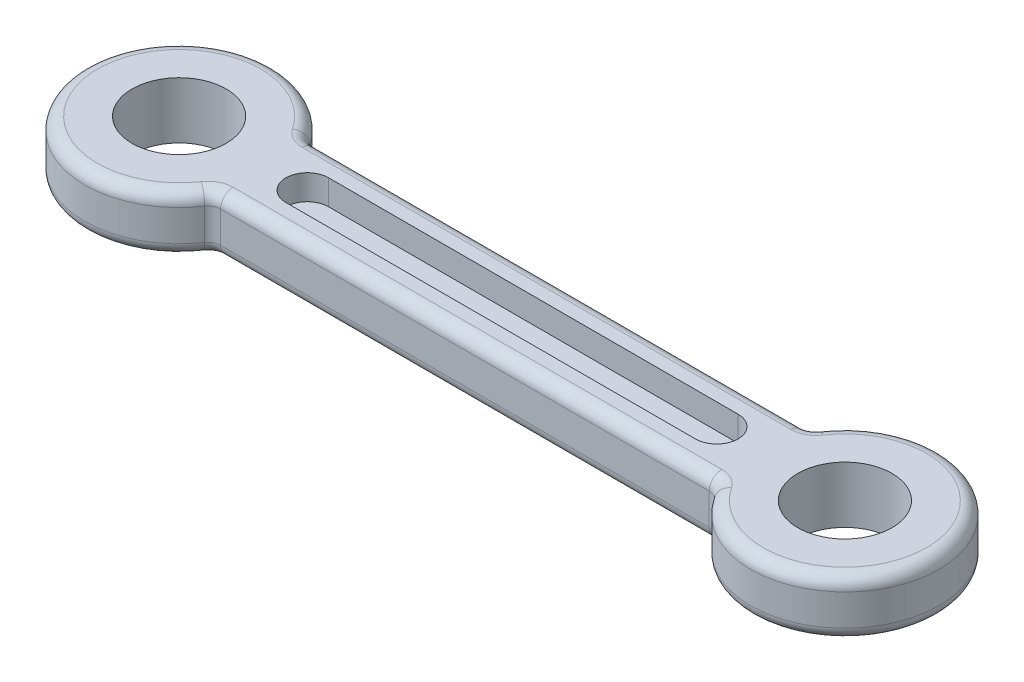
ISO-10303-21;
HEADER;
FILE_DESCRIPTION(('STEP AP214'),'2;1');
FILE_NAME('part.step','',(''),(''),'','','');
FILE_SCHEMA(('AUTOMOTIVE_DESIGN { 1 0 10303 214 1 1 1 1 }'));
ENDSEC;
DATA;
#1=APPLICATION_CONTEXT('core data for automotive mechanical design processes');
#2=APPLICATION_PROTOCOL_DEFINITION('international standard','automotive_design',2000,#1);
#3=PRODUCT_CONTEXT('',#1,'mechanical');
#4=PRODUCT('Part','Part','',(#3));
#5=PRODUCT_RELATED_PRODUCT_CATEGORY('part','',(#4));
#6=PRODUCT_DEFINITION_FORMATION('','',#4);
#7=PRODUCT_DEFINITION_CONTEXT('part definition',#1,'design');
#8=PRODUCT_DEFINITION('design','',#6,#7);
#9=PRODUCT_DEFINITION_SHAPE('','',#8);
#10=(LENGTH_UNIT() NAMED_UNIT(*) SI_UNIT(.MILLI.,.METRE.));
#11=(NAMED_UNIT(*) PLANE_ANGLE_UNIT() SI_UNIT($,.RADIAN.));
#12=(NAMED_UNIT(*) SI_UNIT($,.STERADIAN.) SOLID_ANGLE_UNIT());
#13=UNCERTAINTY_MEASURE_WITH_UNIT(LENGTH_MEASURE(1.E-05),#10,'distance_accuracy_value','');
#14=(GEOMETRIC_REPRESENTATION_CONTEXT(3) GLOBAL_UNCERTAINTY_ASSIGNED_CONTEXT((#13)) GLOBAL_UNIT_ASSIGNED_CONTEXT((#10,
#11,#12)) REPRESENTATION_CONTEXT('',''));
#15=CARTESIAN_POINT('',(0.,0.,0.));
#16=DIRECTION('',(0.,0.,1.));
#17=DIRECTION('',(1.,0.,0.));
#18=AXIS2_PLACEMENT_3D('',#15,#16,#17);
#19=CARTESIAN_POINT('',(134.595567884187,-11.43,0.));
#20=DIRECTION('',(0.,-1.,0.));
#21=DIRECTION('',(0.,0.,-1.));
#22=AXIS2_PLACEMENT_3D('',#19,#20,#21);
#23=PLANE('',#22);
#24=CARTESIAN_POINT('',(-134.595567884187,-11.43,0.));
#25=DIRECTION('',(0.,-1.,0.));
#26=DIRECTION('',(0.,0.,-1.));
#27=AXIS2_PLACEMENT_3D('',#24,#25,#26);
#28=CIRCLE('',#27,33.02);
#29=CARTESIAN_POINT('',(-107.212524391283,-11.43,18.4523529411765));
#30=VERTEX_POINT('',#29);
#31=CARTESIAN_POINT('',(-107.212524391283,-11.43,-18.4523529411765));
#32=VERTEX_POINT('',#31);
#33=EDGE_CURVE('E321',#30,#32,#28,.T.);
#34=ORIENTED_EDGE('',*,*,#33,.T.);
#35=CARTESIAN_POINT('',(-98.786972547313,-11.43,-24.13));
#36=DIRECTION('',(0.,-1.,0.));
#37=DIRECTION('',(0.,0.,-1.));
#38=AXIS2_PLACEMENT_3D('',#35,#36,#37);
#39=CIRCLE('',#38,10.16);
#40=CARTESIAN_POINT('',(-98.786972547313,-11.43,-13.97));
#41=VERTEX_POINT('',#40);
#42=EDGE_CURVE('E335',#32,#41,#39,.F.);
#43=ORIENTED_EDGE('',*,*,#42,.T.);
#44=DIRECTION('',(-1.,0.,0.));
#45=VECTOR('',#44,1.);
#46=CARTESIAN_POINT('',(98.786972547313,-11.43,-13.97));
#47=LINE('',#46,#45);
#48=CARTESIAN_POINT('',(98.786972547313,-11.43,-13.97));
#49=VERTEX_POINT('',#48);
#50=EDGE_CURVE('E333',#41,#49,#47,.F.);
#51=ORIENTED_EDGE('',*,*,#50,.T.);
#52=CARTESIAN_POINT('',(98.786972547313,-11.43,-24.13));
#53=DIRECTION('',(0.,-1.,0.));
#54=DIRECTION('',(0.,0.,-1.));
#55=AXIS2_PLACEMENT_3D('',#52,#53,#54);
#56=CIRCLE('',#55,10.16);
#57=CARTESIAN_POINT('',(107.212524391283,-11.43,-18.4523529411765));
#58=VERTEX_POINT('',#57);
#59=EDGE_CURVE('E331',#49,#58,#56,.F.);
#60=ORIENTED_EDGE('',*,*,#59,.T.);
#61=CARTESIAN_POINT('',(134.595567884187,-11.43,0.));
#62=DIRECTION('',(0.,-1.,0.));
#63=DIRECTION('',(0.,0.,-1.));
#64=AXIS2_PLACEMENT_3D('',#61,#62,#63);
#65=CIRCLE('',#64,33.02);
#66=CARTESIAN_POINT('',(107.212524391283,-11.43,18.4523529411765));
#67=VERTEX_POINT('',#66);
#68=EDGE_CURVE('E329',#58,#67,#65,.T.);
#69=ORIENTED_EDGE('',*,*,#68,.T.);
#70=CARTESIAN_POINT('',(98.786972547313,-11.43,24.13));
#71=DIRECTION('',(0.,-1.,0.));
#72=DIRECTION('',(0.,0.,-1.));
#73=AXIS2_PLACEMENT_3D('',#70,#71,#72);
#74=CIRCLE('',#73,10.16);
#75=CARTESIAN_POINT('',(98.786972547313,-11.43,13.97));
#76=VERTEX_POINT('',#75);
#77=EDGE_CURVE('E327',#67,#76,#74,.F.);
#78=ORIENTED_EDGE('',*,*,#77,.T.);
#79=DIRECTION('',(1.,0.,0.));
#80=VECTOR('',#79,1.);
#81=CARTESIAN_POINT('',(-98.786972547313,-11.43,13.97));
#82=LINE('',#81,#80);
#83=CARTESIAN_POINT('',(-98.786972547313,-11.43,13.97));
#84=VERTEX_POINT('',#83);
#85=EDGE_CURVE('E325',#76,#84,#82,.F.);
#86=ORIENTED_EDGE('',*,*,#85,.T.);
#87=CARTESIAN_POINT('',(-98.786972547313,-11.43,24.13));
#88=DIRECTION('',(0.,-1.,0.));
#89=DIRECTION('',(0.,0.,-1.));
#90=AXIS2_PLACEMENT_3D('',#87,#88,#89);
#91=CIRCLE('',#90,10.16);
#92=EDGE_CURVE('E323',#84,#30,#91,.F.);
#93=ORIENTED_EDGE('',*,*,#92,.T.);
#94=EDGE_LOOP('',(#34,#43,#51,#60,#69,#78,#86,#93));
#95=FACE_BOUND('',#94,.T.);
#96=CARTESIAN_POINT('',(-134.595567884187,-11.43,0.));
#97=DIRECTION('',(0.,1.,0.));
#98=DIRECTION('',(0.,0.,1.));
#99=AXIS2_PLACEMENT_3D('',#96,#97,#98);
#100=CIRCLE('',#99,19.05);
#101=CARTESIAN_POINT('',(-134.595567884187,-11.43,19.05));
#102=VERTEX_POINT('',#101);
#103=EDGE_CURVE('E289',#102,#102,#100,.T.);
#104=ORIENTED_EDGE('',*,*,#103,.T.);
#105=EDGE_LOOP('',(#104));
#106=FACE_BOUND('',#105,.T.);
#107=CARTESIAN_POINT('',(134.595567884187,-11.43,0.));
#108=DIRECTION('',(0.,1.,0.));
#109=DIRECTION('',(0.,0.,-1.));
#110=AXIS2_PLACEMENT_3D('',#107,#108,#109);
#111=CIRCLE('',#110,19.05);
#112=CARTESIAN_POINT('',(134.595567884187,-11.43,-19.05));
#113=VERTEX_POINT('',#112);
#114=EDGE_CURVE('E279',#113,#113,#111,.T.);
#115=ORIENTED_EDGE('',*,*,#114,.T.);
#116=EDGE_LOOP('',(#115));
#117=FACE_BOUND('',#116,.T.);
#118=DIRECTION('',(-1.,0.,0.));
#119=VECTOR('',#118,1.);
#120=CARTESIAN_POINT('',(-82.7792233600561,-11.43,-8.64582999538376));
#121=LINE('',#120,#119);
#122=CARTESIAN_POINT('',(82.7792233600562,-11.43,-8.64582999538376));
#123=VERTEX_POINT('',#122);
#124=CARTESIAN_POINT('',(-82.7792233600561,-11.43,-8.64582999538376));
#125=VERTEX_POINT('',#124);
#126=EDGE_CURVE('E241',#123,#125,#121,.T.);
#127=ORIENTED_EDGE('',*,*,#126,.T.);
#128=CARTESIAN_POINT('',(-82.7792233600561,-11.43,0.));
#129=DIRECTION('',(0.,1.,0.));
#130=DIRECTION('',(0.,0.,1.));
#131=AXIS2_PLACEMENT_3D('',#128,#129,#130);
#132=CIRCLE('',#131,8.64582999538376);
#133=CARTESIAN_POINT('',(-82.7792233600561,-11.43,8.64582999538376));
#134=VERTEX_POINT('',#133);
#135=EDGE_CURVE('E229',#125,#134,#132,.T.);
#136=ORIENTED_EDGE('',*,*,#135,.T.);
#137=DIRECTION('',(1.,0.,0.));
#138=VECTOR('',#137,1.);
#139=CARTESIAN_POINT('',(-82.7792233600561,-11.43,8.64582999538376));
#140=LINE('',#139,#138);
#141=CARTESIAN_POINT('',(82.7792233600562,-11.43,8.64582999538376));
#142=VERTEX_POINT('',#141);
#143=EDGE_CURVE('E233',#134,#142,#140,.T.);
#144=ORIENTED_EDGE('',*,*,#143,.T.);
#145=CARTESIAN_POINT('',(82.7792233600562,-11.43,0.));
#146=DIRECTION('',(0.,1.,0.));
#147=DIRECTION('',(0.,0.,1.));
#148=AXIS2_PLACEMENT_3D('',#145,#146,#147);
#149=CIRCLE('',#148,8.64582999538376);
#150=EDGE_CURVE('E236',#142,#123,#149,.T.);
#151=ORIENTED_EDGE('',*,*,#150,.T.);
#152=EDGE_LOOP('',(#127,#136,#144,#151));
#153=FACE_BOUND('',#152,.T.);
#154=ADVANCED_FACE('F47',(#95,#106,#117,#153),#23,.T.);
#155=CARTESIAN_POINT('',(134.595567884187,11.43,0.));
#156=DIRECTION('',(0.,-1.,0.));
#157=DIRECTION('',(0.,0.,-1.));
#158=AXIS2_PLACEMENT_3D('',#155,#156,#157);
#159=PLANE('',#158);
#160=DIRECTION('',(1.,0.,0.));
#161=VECTOR('',#160,1.);
#162=CARTESIAN_POINT('',(134.595567884187,11.43,13.97));
#163=LINE('',#162,#161);
#164=CARTESIAN_POINT('',(-98.786972547313,11.43,13.97));
#165=VERTEX_POINT('',#164);
#166=CARTESIAN_POINT('',(98.786972547313,11.43,13.97));
#167=VERTEX_POINT('',#166);
#168=EDGE_CURVE('E64',#165,#167,#163,.T.);
#169=ORIENTED_EDGE('',*,*,#168,.T.);
#170=CARTESIAN_POINT('',(98.786972547313,11.43,24.13));
#171=DIRECTION('',(0.,-1.,0.));
#172=DIRECTION('',(0.,0.,-1.));
#173=AXIS2_PLACEMENT_3D('',#170,#171,#172);
#174=CIRCLE('',#173,10.16);
#175=CARTESIAN_POINT('',(107.212524391283,11.43,18.4523529411765));
#176=VERTEX_POINT('',#175);
#177=EDGE_CURVE('E380',#167,#176,#174,.T.);
#178=ORIENTED_EDGE('',*,*,#177,.T.);
#179=CARTESIAN_POINT('',(134.595567884187,11.43,0.));
#180=DIRECTION('',(0.,-1.,0.));
#181=DIRECTION('',(0.,0.,-1.));
#182=AXIS2_PLACEMENT_3D('',#179,#180,#181);
#183=CIRCLE('',#182,33.02);
#184=CARTESIAN_POINT('',(107.212524391283,11.43,-18.4523529411765));
#185=VERTEX_POINT('',#184);
#186=EDGE_CURVE('E368',#176,#185,#183,.F.);
#187=ORIENTED_EDGE('',*,*,#186,.T.);
#188=CARTESIAN_POINT('',(98.786972547313,11.43,-24.13));
#189=DIRECTION('',(0.,-1.,0.));
#190=DIRECTION('',(0.,0.,-1.));
#191=AXIS2_PLACEMENT_3D('',#188,#189,#190);
#192=CIRCLE('',#191,10.16);
#193=CARTESIAN_POINT('',(98.786972547313,11.43,-13.97));
#194=VERTEX_POINT('',#193);
#195=EDGE_CURVE('E370',#185,#194,#192,.T.);
#196=ORIENTED_EDGE('',*,*,#195,.T.);
#197=DIRECTION('',(-1.,0.,0.));
#198=VECTOR('',#197,1.);
#199=CARTESIAN_POINT('',(134.595567884187,11.43,-13.97));
#200=LINE('',#199,#198);
#201=CARTESIAN_POINT('',(-98.786972547313,11.43,-13.97));
#202=VERTEX_POINT('',#201);
#203=EDGE_CURVE('E372',#194,#202,#200,.T.);
#204=ORIENTED_EDGE('',*,*,#203,.T.);
#205=CARTESIAN_POINT('',(-98.786972547313,11.43,-24.13));
#206=DIRECTION('',(0.,-1.,0.));
#207=DIRECTION('',(0.,0.,-1.));
#208=AXIS2_PLACEMENT_3D('',#205,#206,#207);
#209=CIRCLE('',#208,10.16);
#210=CARTESIAN_POINT('',(-107.212524391283,11.43,-18.4523529411765));
#211=VERTEX_POINT('',#210);
#212=EDGE_CURVE('E374',#202,#211,#209,.T.);
#213=ORIENTED_EDGE('',*,*,#212,.T.);
#214=CARTESIAN_POINT('',(-134.595567884187,11.43,0.));
#215=DIRECTION('',(0.,-1.,0.));
#216=DIRECTION('',(0.,0.,-1.));
#217=AXIS2_PLACEMENT_3D('',#214,#215,#216);
#218=CIRCLE('',#217,33.02);
#219=CARTESIAN_POINT('',(-107.212524391283,11.43,18.4523529411765));
#220=VERTEX_POINT('',#219);
#221=EDGE_CURVE('E376',#211,#220,#218,.F.);
#222=ORIENTED_EDGE('',*,*,#221,.T.);
#223=CARTESIAN_POINT('',(-98.786972547313,11.43,24.13));
#224=DIRECTION('',(0.,-1.,0.));
#225=DIRECTION('',(0.,0.,-1.));
#226=AXIS2_PLACEMENT_3D('',#223,#224,#225);
#227=CIRCLE('',#226,10.16);
#228=EDGE_CURVE('E69',#220,#165,#227,.T.);
#229=ORIENTED_EDGE('',*,*,#228,.T.);
#230=EDGE_LOOP('',(#169,#178,#187,#196,#204,#213,#222,#229));
#231=FACE_BOUND('',#230,.T.);
#232=DIRECTION('',(1.,0.,0.));
#233=VECTOR('',#232,1.);
#234=CARTESIAN_POINT('',(-82.7792233600561,11.43,8.64582999538376));
#235=LINE('',#234,#233);
#236=CARTESIAN_POINT('',(-82.7792233600561,11.43,8.64582999538376));
#237=VERTEX_POINT('',#236);
#238=CARTESIAN_POINT('',(82.7792233600562,11.43,8.64582999538376));
#239=VERTEX_POINT('',#238);
#240=EDGE_CURVE('E269',#237,#239,#235,.T.);
#241=ORIENTED_EDGE('',*,*,#240,.F.);
#242=CARTESIAN_POINT('',(-82.7792233600561,11.43,0.));
#243=DIRECTION('',(0.,1.,0.));
#244=DIRECTION('',(0.,0.,1.));
#245=AXIS2_PLACEMENT_3D('',#242,#243,#244);
#246=CIRCLE('',#245,8.64582999538376);
#247=CARTESIAN_POINT('',(-82.7792233600561,11.43,-8.64582999538376));
#248=VERTEX_POINT('',#247);
#249=EDGE_CURVE('E250',#248,#237,#246,.T.);
#250=ORIENTED_EDGE('',*,*,#249,.F.);
#251=DIRECTION('',(-1.,0.,0.));
#252=VECTOR('',#251,1.);
#253=CARTESIAN_POINT('',(-82.7792233600561,11.43,-8.64582999538376));
#254=LINE('',#253,#252);
#255=CARTESIAN_POINT('',(82.7792233600562,11.43,-8.64582999538376));
#256=VERTEX_POINT('',#255);
#257=EDGE_CURVE('E258',#256,#248,#254,.T.);
#258=ORIENTED_EDGE('',*,*,#257,.F.);
#259=CARTESIAN_POINT('',(82.7792233600562,11.43,0.));
#260=DIRECTION('',(0.,1.,0.));
#261=DIRECTION('',(0.,0.,1.));
#262=AXIS2_PLACEMENT_3D('',#259,#260,#261);
#263=CIRCLE('',#262,8.64582999538376);
#264=EDGE_CURVE('E272',#239,#256,#263,.T.);
#265=ORIENTED_EDGE('',*,*,#264,.F.);
#266=EDGE_LOOP('',(#241,#250,#258,#265));
#267=FACE_BOUND('',#266,.T.);
#268=CARTESIAN_POINT('',(-134.595567884187,11.43,0.));
#269=DIRECTION('',(0.,1.,0.));
#270=DIRECTION('',(0.,0.,1.));
#271=AXIS2_PLACEMENT_3D('',#268,#269,#270);
#272=CIRCLE('',#271,19.05);
#273=CARTESIAN_POINT('',(-134.595567884187,11.43,19.05));
#274=VERTEX_POINT('',#273);
#275=EDGE_CURVE('E292',#274,#274,#272,.T.);
#276=ORIENTED_EDGE('',*,*,#275,.F.);
#277=EDGE_LOOP('',(#276));
#278=FACE_BOUND('',#277,.T.);
#279=CARTESIAN_POINT('',(134.595567884187,11.43,0.));
#280=DIRECTION('',(0.,1.,0.));
#281=DIRECTION('',(0.,0.,-1.));
#282=AXIS2_PLACEMENT_3D('',#279,#280,#281);
#283=CIRCLE('',#282,19.05);
#284=CARTESIAN_POINT('',(134.595567884187,11.43,-19.05));
#285=VERTEX_POINT('',#284);
#286=EDGE_CURVE('E286',#285,#285,#283,.T.);
#287=ORIENTED_EDGE('',*,*,#286,.F.);
#288=EDGE_LOOP('',(#287));
#289=FACE_BOUND('',#288,.T.);
#290=ADVANCED_FACE('F529',(#231,#267,#278,#289),#159,.F.);
#291=CARTESIAN_POINT('',(134.595567884187,11.43,0.));
#292=DIRECTION('',(0.,-1.,0.));
#293=DIRECTION('',(0.,0.,-1.));
#294=AXIS2_PLACEMENT_3D('',#291,#292,#293);
#295=CYLINDRICAL_SURFACE('',#294,38.1);
#296=DIRECTION('',(0.,-1.,0.));
#297=VECTOR('',#296,1.);
#298=CARTESIAN_POINT('',(102.999748469298,11.43,21.2911764705882));
#299=LINE('',#298,#297);
#300=CARTESIAN_POINT('',(102.999748469298,6.35,21.2911764705882));
#301=VERTEX_POINT('',#300);
#302=CARTESIAN_POINT('',(102.999748469298,-6.35,21.2911764705882));
#303=VERTEX_POINT('',#302);
#304=EDGE_CURVE('E318',#301,#303,#299,.T.);
#305=ORIENTED_EDGE('',*,*,#304,.T.);
#306=CARTESIAN_POINT('',(134.595567884187,-6.35,0.));
#307=DIRECTION('',(0.,-1.,0.));
#308=DIRECTION('',(0.,0.,-1.));
#309=AXIS2_PLACEMENT_3D('',#306,#307,#308);
#310=CIRCLE('',#309,38.1);
#311=CARTESIAN_POINT('',(102.999748469298,-6.35,-21.2911764705882));
#312=VERTEX_POINT('',#311);
#313=EDGE_CURVE('E353',#303,#312,#310,.F.);
#314=ORIENTED_EDGE('',*,*,#313,.T.);
#315=DIRECTION('',(0.,-1.,0.));
#316=VECTOR('',#315,1.);
#317=CARTESIAN_POINT('',(102.999748469298,11.43,-21.2911764705882));
#318=LINE('',#317,#316);
#319=CARTESIAN_POINT('',(102.999748469298,6.35,-21.2911764705882));
#320=VERTEX_POINT('',#319);
#321=EDGE_CURVE('E315',#312,#320,#318,.F.);
#322=ORIENTED_EDGE('',*,*,#321,.T.);
#323=CARTESIAN_POINT('',(134.595567884187,6.35,0.));
#324=DIRECTION('',(0.,-1.,0.));
#325=DIRECTION('',(0.,0.,-1.));
#326=AXIS2_PLACEMENT_3D('',#323,#324,#325);
#327=CIRCLE('',#326,38.1);
#328=EDGE_CURVE('E351',#320,#301,#327,.T.);
#329=ORIENTED_EDGE('',*,*,#328,.T.);
#330=EDGE_LOOP('',(#305,#314,#322,#329));
#331=FACE_BOUND('',#330,.T.);
#332=ADVANCED_FACE('F497',(#331),#295,.T.);
#333=CARTESIAN_POINT('',(-101.6,11.43,-19.05));
#334=DIRECTION('',(0.,0.,1.));
#335=DIRECTION('',(1.,0.,0.));
#336=AXIS2_PLACEMENT_3D('',#333,#334,#335);
#337=PLANE('',#336);
#338=DIRECTION('',(0.,1.,0.));
#339=VECTOR('',#338,1.);
#340=CARTESIAN_POINT('',(98.786972547313,-11.43,-19.05));
#341=LINE('',#340,#339);
#342=CARTESIAN_POINT('',(98.786972547313,6.35,-19.05));
#343=VERTEX_POINT('',#342);
#344=CARTESIAN_POINT('',(98.786972547313,-6.35,-19.05));
#345=VERTEX_POINT('',#344);
#346=EDGE_CURVE('E303',#343,#345,#341,.F.);
#347=ORIENTED_EDGE('',*,*,#346,.T.);
#348=DIRECTION('',(-1.,0.,0.));
#349=VECTOR('',#348,1.);
#350=CARTESIAN_POINT('',(-98.786972547313,-6.35,-19.05));
#351=LINE('',#350,#349);
#352=CARTESIAN_POINT('',(-98.786972547313,-6.35,-19.05));
#353=VERTEX_POINT('',#352);
#354=EDGE_CURVE('E345',#345,#353,#351,.T.);
#355=ORIENTED_EDGE('',*,*,#354,.T.);
#356=DIRECTION('',(0.,1.,0.));
#357=VECTOR('',#356,1.);
#358=CARTESIAN_POINT('',(-98.786972547313,11.43,-19.05));
#359=LINE('',#358,#357);
#360=CARTESIAN_POINT('',(-98.786972547313,6.35,-19.05));
#361=VERTEX_POINT('',#360);
#362=EDGE_CURVE('E306',#353,#361,#359,.T.);
#363=ORIENTED_EDGE('',*,*,#362,.T.);
#364=DIRECTION('',(-1.,0.,0.));
#365=VECTOR('',#364,1.);
#366=CARTESIAN_POINT('',(-101.6,6.35,-19.05));
#367=LINE('',#366,#365);
#368=EDGE_CURVE('E343',#361,#343,#367,.F.);
#369=ORIENTED_EDGE('',*,*,#368,.T.);
#370=EDGE_LOOP('',(#347,#355,#363,#369));
#371=FACE_BOUND('',#370,.T.);
#372=ADVANCED_FACE('F441',(#371),#337,.F.);
#373=CARTESIAN_POINT('',(-134.595567884187,11.43,0.));
#374=DIRECTION('',(0.,-1.,0.));
#375=DIRECTION('',(0.,0.,-1.));
#376=AXIS2_PLACEMENT_3D('',#373,#374,#375);
#377=CYLINDRICAL_SURFACE('',#376,38.1);
#378=DIRECTION('',(0.,-1.,0.));
#379=VECTOR('',#378,1.);
#380=CARTESIAN_POINT('',(-102.999748469298,11.43,21.2911764705882));
#381=LINE('',#380,#379);
#382=CARTESIAN_POINT('',(-102.999748469298,-6.35,21.2911764705882));
#383=VERTEX_POINT('',#382);
#384=CARTESIAN_POINT('',(-102.999748469298,6.35,21.2911764705882));
#385=VERTEX_POINT('',#384);
#386=EDGE_CURVE('E295',#383,#385,#381,.F.);
#387=ORIENTED_EDGE('',*,*,#386,.T.);
#388=CARTESIAN_POINT('',(-134.595567884187,6.35,0.));
#389=DIRECTION('',(0.,-1.,0.));
#390=DIRECTION('',(0.,0.,-1.));
#391=AXIS2_PLACEMENT_3D('',#388,#389,#390);
#392=CIRCLE('',#391,38.1);
#393=CARTESIAN_POINT('',(-102.999748469298,6.35,-21.2911764705882));
#394=VERTEX_POINT('',#393);
#395=EDGE_CURVE('E12',#385,#394,#392,.T.);
#396=ORIENTED_EDGE('',*,*,#395,.T.);
#397=DIRECTION('',(0.,-1.,0.));
#398=VECTOR('',#397,1.);
#399=CARTESIAN_POINT('',(-102.999748469298,11.43,-21.2911764705882));
#400=LINE('',#399,#398);
#401=CARTESIAN_POINT('',(-102.999748469298,-6.35,-21.2911764705882));
#402=VERTEX_POINT('',#401);
#403=EDGE_CURVE('E300',#394,#402,#400,.T.);
#404=ORIENTED_EDGE('',*,*,#403,.T.);
#405=CARTESIAN_POINT('',(-134.595567884187,-6.35,0.));
#406=DIRECTION('',(0.,-1.,0.));
#407=DIRECTION('',(0.,0.,-1.));
#408=AXIS2_PLACEMENT_3D('',#405,#406,#407);
#409=CIRCLE('',#408,38.1);
#410=EDGE_CURVE('E56',#402,#383,#409,.F.);
#411=ORIENTED_EDGE('',*,*,#410,.T.);
#412=EDGE_LOOP('',(#387,#396,#404,#411));
#413=FACE_BOUND('',#412,.T.);
#414=ADVANCED_FACE('F455',(#413),#377,.T.);
#415=CARTESIAN_POINT('',(-101.6,11.43,19.05));
#416=DIRECTION('',(0.,0.,-1.));
#417=DIRECTION('',(-1.,0.,0.));
#418=AXIS2_PLACEMENT_3D('',#415,#416,#417);
#419=PLANE('',#418);
#420=DIRECTION('',(0.,1.,0.));
#421=VECTOR('',#420,1.);
#422=CARTESIAN_POINT('',(-98.786972547313,-11.43,19.05));
#423=LINE('',#422,#421);
#424=CARTESIAN_POINT('',(-98.786972547313,6.35,19.05));
#425=VERTEX_POINT('',#424);
#426=CARTESIAN_POINT('',(-98.786972547313,-6.35,19.05));
#427=VERTEX_POINT('',#426);
#428=EDGE_CURVE('E312',#425,#427,#423,.F.);
#429=ORIENTED_EDGE('',*,*,#428,.T.);
#430=DIRECTION('',(1.,0.,0.));
#431=VECTOR('',#430,1.);
#432=CARTESIAN_POINT('',(98.786972547313,-6.35,19.05));
#433=LINE('',#432,#431);
#434=CARTESIAN_POINT('',(98.786972547313,-6.35,19.05));
#435=VERTEX_POINT('',#434);
#436=EDGE_CURVE('E362',#427,#435,#433,.T.);
#437=ORIENTED_EDGE('',*,*,#436,.T.);
#438=DIRECTION('',(0.,1.,0.));
#439=VECTOR('',#438,1.);
#440=CARTESIAN_POINT('',(98.786972547313,11.43,19.05));
#441=LINE('',#440,#439);
#442=CARTESIAN_POINT('',(98.786972547313,6.35,19.05));
#443=VERTEX_POINT('',#442);
#444=EDGE_CURVE('E309',#435,#443,#441,.T.);
#445=ORIENTED_EDGE('',*,*,#444,.T.);
#446=DIRECTION('',(1.,0.,0.));
#447=VECTOR('',#446,1.);
#448=CARTESIAN_POINT('',(-101.6,6.35,19.05));
#449=LINE('',#448,#447);
#450=EDGE_CURVE('E360',#443,#425,#449,.F.);
#451=ORIENTED_EDGE('',*,*,#450,.T.);
#452=EDGE_LOOP('',(#429,#437,#445,#451));
#453=FACE_BOUND('',#452,.T.);
#454=ADVANCED_FACE('F480',(#453),#419,.F.);
#455=CARTESIAN_POINT('',(-134.595567884187,11.43,0.));
#456=DIRECTION('',(0.,-1.,0.));
#457=DIRECTION('',(0.,0.,-1.));
#458=AXIS2_PLACEMENT_3D('',#455,#456,#457);
#459=CYLINDRICAL_SURFACE('',#458,19.05);
#460=ORIENTED_EDGE('',*,*,#275,.T.);
#461=EDGE_LOOP('',(#460));
#462=FACE_BOUND('',#461,.T.);
#463=ORIENTED_EDGE('',*,*,#103,.F.);
#464=EDGE_LOOP('',(#463));
#465=FACE_BOUND('',#464,.T.);
#466=ADVANCED_FACE('F539',(#462,#465),#459,.F.);
#467=CARTESIAN_POINT('',(134.595567884187,11.43,0.));
#468=DIRECTION('',(0.,-1.,0.));
#469=DIRECTION('',(0.,0.,-1.));
#470=AXIS2_PLACEMENT_3D('',#467,#468,#469);
#471=CYLINDRICAL_SURFACE('',#470,19.05);
#472=ORIENTED_EDGE('',*,*,#286,.T.);
#473=EDGE_LOOP('',(#472));
#474=FACE_BOUND('',#473,.T.);
#475=ORIENTED_EDGE('',*,*,#114,.F.);
#476=EDGE_LOOP('',(#475));
#477=FACE_BOUND('',#476,.T.);
#478=ADVANCED_FACE('F786',(#474,#477),#471,.F.);
#479=CARTESIAN_POINT('',(-82.7792233600561,1.27,0.));
#480=DIRECTION('',(0.,1.,0.));
#481=DIRECTION('',(0.,0.,1.));
#482=AXIS2_PLACEMENT_3D('',#479,#480,#481);
#483=CYLINDRICAL_SURFACE('',#482,8.64582999538376);
#484=ORIENTED_EDGE('',*,*,#249,.T.);
#485=DIRECTION('',(0.,1.,0.));
#486=VECTOR('',#485,1.);
#487=CARTESIAN_POINT('',(-82.7792233600561,1.27,8.64582999538376));
#488=LINE('',#487,#486);
#489=CARTESIAN_POINT('',(-82.7792233600561,1.27,8.64582999538376));
#490=VERTEX_POINT('',#489);
#491=EDGE_CURVE('E267',#490,#237,#488,.T.);
#492=ORIENTED_EDGE('',*,*,#491,.F.);
#493=CARTESIAN_POINT('',(-82.7792233600561,1.27,0.));
#494=DIRECTION('',(0.,1.,0.));
#495=DIRECTION('',(0.,0.,1.));
#496=AXIS2_PLACEMENT_3D('',#493,#494,#495);
#497=CIRCLE('',#496,8.64582999538376);
#498=CARTESIAN_POINT('',(-82.7792233600561,1.27,-8.64582999538376));
#499=VERTEX_POINT('',#498);
#500=EDGE_CURVE('E254',#499,#490,#497,.T.);
#501=ORIENTED_EDGE('',*,*,#500,.F.);
#502=DIRECTION('',(0.,1.,0.));
#503=VECTOR('',#502,1.);
#504=CARTESIAN_POINT('',(-82.7792233600561,1.27,-8.64582999538376));
#505=LINE('',#504,#503);
#506=EDGE_CURVE('E277',#499,#248,#505,.T.);
#507=ORIENTED_EDGE('',*,*,#506,.T.);
#508=EDGE_LOOP('',(#484,#492,#501,#507));
#509=FACE_BOUND('',#508,.T.);
#510=ADVANCED_FACE('F777',(#509),#483,.F.);
#511=CARTESIAN_POINT('',(-82.7792233600561,1.27,-8.64582999538376));
#512=DIRECTION('',(0.,0.,-1.));
#513=DIRECTION('',(-1.,0.,0.));
#514=AXIS2_PLACEMENT_3D('',#511,#512,#513);
#515=PLANE('',#514);
#516=ORIENTED_EDGE('',*,*,#257,.T.);
#517=ORIENTED_EDGE('',*,*,#506,.F.);
#518=DIRECTION('',(-1.,0.,0.));
#519=VECTOR('',#518,1.);
#520=CARTESIAN_POINT('',(-82.7792233600561,1.27,-8.64582999538376));
#521=LINE('',#520,#519);
#522=CARTESIAN_POINT('',(82.7792233600562,1.27,-8.64582999538376));
#523=VERTEX_POINT('',#522);
#524=EDGE_CURVE('E264',#523,#499,#521,.T.);
#525=ORIENTED_EDGE('',*,*,#524,.F.);
#526=DIRECTION('',(0.,1.,0.));
#527=VECTOR('',#526,1.);
#528=CARTESIAN_POINT('',(82.7792233600562,1.27,-8.64582999538376));
#529=LINE('',#528,#527);
#530=EDGE_CURVE('E280',#523,#256,#529,.T.);
#531=ORIENTED_EDGE('',*,*,#530,.T.);
#532=EDGE_LOOP('',(#516,#517,#525,#531));
#533=FACE_BOUND('',#532,.T.);
#534=ADVANCED_FACE('F768',(#533),#515,.F.);
#535=CARTESIAN_POINT('',(82.7792233600562,1.27,0.));
#536=DIRECTION('',(0.,1.,0.));
#537=DIRECTION('',(0.,0.,1.));
#538=AXIS2_PLACEMENT_3D('',#535,#536,#537);
#539=CYLINDRICAL_SURFACE('',#538,8.64582999538376);
#540=ORIENTED_EDGE('',*,*,#264,.T.);
#541=ORIENTED_EDGE('',*,*,#530,.F.);
#542=CARTESIAN_POINT('',(82.7792233600562,1.27,0.));
#543=DIRECTION('',(0.,1.,0.));
#544=DIRECTION('',(0.,0.,1.));
#545=AXIS2_PLACEMENT_3D('',#542,#543,#544);
#546=CIRCLE('',#545,8.64582999538376);
#547=CARTESIAN_POINT('',(82.7792233600562,1.27,8.64582999538376));
#548=VERTEX_POINT('',#547);
#549=EDGE_CURVE('E261',#548,#523,#546,.T.);
#550=ORIENTED_EDGE('',*,*,#549,.F.);
#551=DIRECTION('',(0.,1.,0.));
#552=VECTOR('',#551,1.);
#553=CARTESIAN_POINT('',(82.7792233600562,1.27,8.64582999538376));
#554=LINE('',#553,#552);
#555=EDGE_CURVE('E282',#548,#239,#554,.T.);
#556=ORIENTED_EDGE('',*,*,#555,.T.);
#557=EDGE_LOOP('',(#540,#541,#550,#556));
#558=FACE_BOUND('',#557,.T.);
#559=ADVANCED_FACE('F759',(#558),#539,.F.);
#560=CARTESIAN_POINT('',(-82.7792233600561,1.27,8.64582999538376));
#561=DIRECTION('',(0.,0.,1.));
#562=DIRECTION('',(1.,0.,0.));
#563=AXIS2_PLACEMENT_3D('',#560,#561,#562);
#564=PLANE('',#563);
#565=ORIENTED_EDGE('',*,*,#240,.T.);
#566=ORIENTED_EDGE('',*,*,#555,.F.);
#567=DIRECTION('',(1.,0.,0.));
#568=VECTOR('',#567,1.);
#569=CARTESIAN_POINT('',(-82.7792233600561,1.27,8.64582999538376));
#570=LINE('',#569,#568);
#571=EDGE_CURVE('E257',#490,#548,#570,.T.);
#572=ORIENTED_EDGE('',*,*,#571,.F.);
#573=ORIENTED_EDGE('',*,*,#491,.T.);
#574=EDGE_LOOP('',(#565,#566,#572,#573));
#575=FACE_BOUND('',#574,.T.);
#576=ADVANCED_FACE('F750',(#575),#564,.F.);
#577=CARTESIAN_POINT('',(-82.7792233600561,1.27,0.));
#578=DIRECTION('',(0.,1.,0.));
#579=DIRECTION('',(0.,0.,1.));
#580=AXIS2_PLACEMENT_3D('',#577,#578,#579);
#581=PLANE('',#580);
#582=ORIENTED_EDGE('',*,*,#500,.T.);
#583=ORIENTED_EDGE('',*,*,#571,.T.);
#584=ORIENTED_EDGE('',*,*,#549,.T.);
#585=ORIENTED_EDGE('',*,*,#524,.T.);
#586=EDGE_LOOP('',(#582,#583,#584,#585));
#587=FACE_BOUND('',#586,.T.);
#588=ADVANCED_FACE('F737',(#587),#581,.T.);
#589=CARTESIAN_POINT('',(-82.7792233600561,-1.27,0.));
#590=DIRECTION('',(0.,-1.,0.));
#591=DIRECTION('',(0.,0.,-1.));
#592=AXIS2_PLACEMENT_3D('',#589,#590,#591);
#593=CYLINDRICAL_SURFACE('',#592,8.64582999538376);
#594=ORIENTED_EDGE('',*,*,#135,.F.);
#595=DIRECTION('',(0.,-1.,0.));
#596=VECTOR('',#595,1.);
#597=CARTESIAN_POINT('',(-82.7792233600561,-1.27,-8.64582999538376));
#598=LINE('',#597,#596);
#599=CARTESIAN_POINT('',(-82.7792233600561,-1.27,-8.64582999538376));
#600=VERTEX_POINT('',#599);
#601=EDGE_CURVE('E214',#600,#125,#598,.T.);
#602=ORIENTED_EDGE('',*,*,#601,.F.);
#603=CARTESIAN_POINT('',(-82.7792233600561,-1.27,0.));
#604=DIRECTION('',(0.,1.,0.));
#605=DIRECTION('',(0.,0.,1.));
#606=AXIS2_PLACEMENT_3D('',#603,#604,#605);
#607=CIRCLE('',#606,8.64582999538376);
#608=CARTESIAN_POINT('',(-82.7792233600561,-1.27,8.64582999538376));
#609=VERTEX_POINT('',#608);
#610=EDGE_CURVE('E221',#600,#609,#607,.T.);
#611=ORIENTED_EDGE('',*,*,#610,.T.);
#612=DIRECTION('',(0.,-1.,0.));
#613=VECTOR('',#612,1.);
#614=CARTESIAN_POINT('',(-82.7792233600561,-1.27,8.64582999538376));
#615=LINE('',#614,#613);
#616=EDGE_CURVE('E248',#609,#134,#615,.T.);
#617=ORIENTED_EDGE('',*,*,#616,.T.);
#618=EDGE_LOOP('',(#594,#602,#611,#617));
#619=FACE_BOUND('',#618,.T.);
#620=ADVANCED_FACE('F225',(#619),#593,.F.);
#621=CARTESIAN_POINT('',(-82.7792233600561,-1.27,8.64582999538376));
#622=DIRECTION('',(0.,0.,-1.));
#623=DIRECTION('',(-1.,0.,0.));
#624=AXIS2_PLACEMENT_3D('',#621,#622,#623);
#625=PLANE('',#624);
#626=ORIENTED_EDGE('',*,*,#143,.F.);
#627=ORIENTED_EDGE('',*,*,#616,.F.);
#628=DIRECTION('',(1.,0.,0.));
#629=VECTOR('',#628,1.);
#630=CARTESIAN_POINT('',(-82.7792233600561,-1.27,8.64582999538376));
#631=LINE('',#630,#629);
#632=CARTESIAN_POINT('',(82.7792233600562,-1.27,8.64582999538376));
#633=VERTEX_POINT('',#632);
#634=EDGE_CURVE('E230',#609,#633,#631,.T.);
#635=ORIENTED_EDGE('',*,*,#634,.T.);
#636=DIRECTION('',(0.,-1.,0.));
#637=VECTOR('',#636,1.);
#638=CARTESIAN_POINT('',(82.7792233600562,-1.27,8.64582999538376));
#639=LINE('',#638,#637);
#640=EDGE_CURVE('E251',#633,#142,#639,.T.);
#641=ORIENTED_EDGE('',*,*,#640,.T.);
#642=EDGE_LOOP('',(#626,#627,#635,#641));
#643=FACE_BOUND('',#642,.T.);
#644=ADVANCED_FACE('F720',(#643),#625,.T.);
#645=CARTESIAN_POINT('',(82.7792233600562,-1.27,0.));
#646=DIRECTION('',(0.,-1.,0.));
#647=DIRECTION('',(0.,0.,-1.));
#648=AXIS2_PLACEMENT_3D('',#645,#646,#647);
#649=CYLINDRICAL_SURFACE('',#648,8.64582999538376);
#650=ORIENTED_EDGE('',*,*,#150,.F.);
#651=ORIENTED_EDGE('',*,*,#640,.F.);
#652=CARTESIAN_POINT('',(82.7792233600562,-1.27,0.));
#653=DIRECTION('',(0.,1.,0.));
#654=DIRECTION('',(0.,0.,1.));
#655=AXIS2_PLACEMENT_3D('',#652,#653,#654);
#656=CIRCLE('',#655,8.64582999538376);
#657=CARTESIAN_POINT('',(82.7792233600562,-1.27,-8.64582999538376));
#658=VERTEX_POINT('',#657);
#659=EDGE_CURVE('E220',#633,#658,#656,.T.);
#660=ORIENTED_EDGE('',*,*,#659,.T.);
#661=DIRECTION('',(0.,-1.,0.));
#662=VECTOR('',#661,1.);
#663=CARTESIAN_POINT('',(82.7792233600562,-1.27,-8.64582999538376));
#664=LINE('',#663,#662);
#665=EDGE_CURVE('E216',#658,#123,#664,.T.);
#666=ORIENTED_EDGE('',*,*,#665,.T.);
#667=EDGE_LOOP('',(#650,#651,#660,#666));
#668=FACE_BOUND('',#667,.T.);
#669=ADVANCED_FACE('F712',(#668),#649,.F.);
#670=CARTESIAN_POINT('',(-82.7792233600561,-1.27,-8.64582999538376));
#671=DIRECTION('',(0.,0.,1.));
#672=DIRECTION('',(1.,0.,0.));
#673=AXIS2_PLACEMENT_3D('',#670,#671,#672);
#674=PLANE('',#673);
#675=ORIENTED_EDGE('',*,*,#126,.F.);
#676=ORIENTED_EDGE('',*,*,#665,.F.);
#677=DIRECTION('',(-1.,0.,0.));
#678=VECTOR('',#677,1.);
#679=CARTESIAN_POINT('',(-82.7792233600561,-1.27,-8.64582999538376));
#680=LINE('',#679,#678);
#681=EDGE_CURVE('E210',#658,#600,#680,.T.);
#682=ORIENTED_EDGE('',*,*,#681,.T.);
#683=ORIENTED_EDGE('',*,*,#601,.T.);
#684=EDGE_LOOP('',(#675,#676,#682,#683));
#685=FACE_BOUND('',#684,.T.);
#686=ADVANCED_FACE('F213',(#685),#674,.T.);
#687=CARTESIAN_POINT('',(-82.7792233600561,-1.27,0.));
#688=DIRECTION('',(0.,-1.,0.));
#689=DIRECTION('',(0.,0.,1.));
#690=AXIS2_PLACEMENT_3D('',#687,#688,#689);
#691=PLANE('',#690);
#692=ORIENTED_EDGE('',*,*,#610,.F.);
#693=ORIENTED_EDGE('',*,*,#681,.F.);
#694=ORIENTED_EDGE('',*,*,#659,.F.);
#695=ORIENTED_EDGE('',*,*,#634,.F.);
#696=EDGE_LOOP('',(#692,#693,#694,#695));
#697=FACE_BOUND('',#696,.T.);
#698=ADVANCED_FACE('F232',(#697),#691,.T.);
#699=CARTESIAN_POINT('',(-98.786972547313,11.43,-24.13));
#700=DIRECTION('',(0.,-1.,0.));
#701=DIRECTION('',(0.,0.,-1.));
#702=AXIS2_PLACEMENT_3D('',#699,#700,#701);
#703=CYLINDRICAL_SURFACE('',#702,5.08);
#704=ORIENTED_EDGE('',*,*,#362,.F.);
#705=CARTESIAN_POINT('',(-98.786972547313,-6.35,-24.13));
#706=DIRECTION('',(0.,-1.,0.));
#707=DIRECTION('',(0.,0.,-1.));
#708=AXIS2_PLACEMENT_3D('',#705,#706,#707);
#709=CIRCLE('',#708,5.08);
#710=EDGE_CURVE('E340',#353,#402,#709,.T.);
#711=ORIENTED_EDGE('',*,*,#710,.T.);
#712=ORIENTED_EDGE('',*,*,#403,.F.);
#713=CARTESIAN_POINT('',(-98.786972547313,6.35,-24.13));
#714=DIRECTION('',(0.,-1.,0.));
#715=DIRECTION('',(0.,0.,-1.));
#716=AXIS2_PLACEMENT_3D('',#713,#714,#715);
#717=CIRCLE('',#716,5.08);
#718=EDGE_CURVE('E338',#394,#361,#717,.F.);
#719=ORIENTED_EDGE('',*,*,#718,.T.);
#720=EDGE_LOOP('',(#704,#711,#712,#719));
#721=FACE_BOUND('',#720,.T.);
#722=ADVANCED_FACE('F438',(#721),#703,.F.);
#723=CARTESIAN_POINT('',(-98.786972547313,11.43,24.13));
#724=DIRECTION('',(0.,-1.,0.));
#725=DIRECTION('',(0.,0.,-1.));
#726=AXIS2_PLACEMENT_3D('',#723,#724,#725);
#727=CYLINDRICAL_SURFACE('',#726,5.08);
#728=ORIENTED_EDGE('',*,*,#386,.F.);
#729=CARTESIAN_POINT('',(-98.786972547313,-6.35,24.13));
#730=DIRECTION('',(0.,-1.,0.));
#731=DIRECTION('',(0.,0.,-1.));
#732=AXIS2_PLACEMENT_3D('',#729,#730,#731);
#733=CIRCLE('',#732,5.08);
#734=EDGE_CURVE('E366',#383,#427,#733,.T.);
#735=ORIENTED_EDGE('',*,*,#734,.T.);
#736=ORIENTED_EDGE('',*,*,#428,.F.);
#737=CARTESIAN_POINT('',(-98.786972547313,6.35,24.13));
#738=DIRECTION('',(0.,-1.,0.));
#739=DIRECTION('',(0.,0.,-1.));
#740=AXIS2_PLACEMENT_3D('',#737,#738,#739);
#741=CIRCLE('',#740,5.08);
#742=EDGE_CURVE('E364',#425,#385,#741,.F.);
#743=ORIENTED_EDGE('',*,*,#742,.T.);
#744=EDGE_LOOP('',(#728,#735,#736,#743));
#745=FACE_BOUND('',#744,.T.);
#746=ADVANCED_FACE('F459',(#745),#727,.F.);
#747=CARTESIAN_POINT('',(98.786972547313,11.43,24.13));
#748=DIRECTION('',(0.,-1.,0.));
#749=DIRECTION('',(0.,0.,-1.));
#750=AXIS2_PLACEMENT_3D('',#747,#748,#749);
#751=CYLINDRICAL_SURFACE('',#750,5.08);
#752=ORIENTED_EDGE('',*,*,#444,.F.);
#753=CARTESIAN_POINT('',(98.786972547313,-6.35,24.13));
#754=DIRECTION('',(0.,-1.,0.));
#755=DIRECTION('',(0.,0.,-1.));
#756=AXIS2_PLACEMENT_3D('',#753,#754,#755);
#757=CIRCLE('',#756,5.08);
#758=EDGE_CURVE('E358',#435,#303,#757,.T.);
#759=ORIENTED_EDGE('',*,*,#758,.T.);
#760=ORIENTED_EDGE('',*,*,#304,.F.);
#761=CARTESIAN_POINT('',(98.786972547313,6.35,24.13));
#762=DIRECTION('',(0.,-1.,0.));
#763=DIRECTION('',(0.,0.,-1.));
#764=AXIS2_PLACEMENT_3D('',#761,#762,#763);
#765=CIRCLE('',#764,5.08);
#766=EDGE_CURVE('E355',#301,#443,#765,.F.);
#767=ORIENTED_EDGE('',*,*,#766,.T.);
#768=EDGE_LOOP('',(#752,#759,#760,#767));
#769=FACE_BOUND('',#768,.T.);
#770=ADVANCED_FACE('F483',(#769),#751,.F.);
#771=CARTESIAN_POINT('',(98.786972547313,11.43,-24.13));
#772=DIRECTION('',(0.,-1.,0.));
#773=DIRECTION('',(0.,0.,-1.));
#774=AXIS2_PLACEMENT_3D('',#771,#772,#773);
#775=CYLINDRICAL_SURFACE('',#774,5.08);
#776=ORIENTED_EDGE('',*,*,#321,.F.);
#777=CARTESIAN_POINT('',(98.786972547313,-6.35,-24.13));
#778=DIRECTION('',(0.,-1.,0.));
#779=DIRECTION('',(0.,0.,-1.));
#780=AXIS2_PLACEMENT_3D('',#777,#778,#779);
#781=CIRCLE('',#780,5.08);
#782=EDGE_CURVE('E349',#312,#345,#781,.T.);
#783=ORIENTED_EDGE('',*,*,#782,.T.);
#784=ORIENTED_EDGE('',*,*,#346,.F.);
#785=CARTESIAN_POINT('',(98.786972547313,6.35,-24.13));
#786=DIRECTION('',(0.,-1.,0.));
#787=DIRECTION('',(0.,0.,-1.));
#788=AXIS2_PLACEMENT_3D('',#785,#786,#787);
#789=CIRCLE('',#788,5.08);
#790=EDGE_CURVE('E347',#343,#320,#789,.F.);
#791=ORIENTED_EDGE('',*,*,#790,.T.);
#792=EDGE_LOOP('',(#776,#783,#784,#791));
#793=FACE_BOUND('',#792,.T.);
#794=ADVANCED_FACE('F500',(#793),#775,.F.);
#795=CARTESIAN_POINT('',(98.786972547313,-6.35,24.13));
#796=DIRECTION('',(0.,-1.,0.));
#797=DIRECTION('',(0.,0.,-1.));
#798=AXIS2_PLACEMENT_3D('',#795,#796,#797);
#799=TOROIDAL_SURFACE('',#798,10.16,5.08);
#800=CARTESIAN_POINT('',(107.212524391283,-6.35,18.4523529411765));
#801=DIRECTION('',(0.558823529411765,0.,0.829286598815981));
#802=DIRECTION('',(0.829286598815981,0.,-0.558823529411765));
#803=AXIS2_PLACEMENT_3D('',#800,#801,#802);
#804=CIRCLE('',#803,5.08);
#805=EDGE_CURVE('E399',#303,#67,#804,.T.);
#806=ORIENTED_EDGE('',*,*,#805,.F.);
#807=ORIENTED_EDGE('',*,*,#758,.F.);
#808=CARTESIAN_POINT('',(98.786972547313,-6.35,13.97));
#809=DIRECTION('',(-1.,0.,0.));
#810=DIRECTION('',(0.,0.,1.));
#811=AXIS2_PLACEMENT_3D('',#808,#809,#810);
#812=CIRCLE('',#811,5.08);
#813=EDGE_CURVE('E242',#76,#435,#812,.T.);
#814=ORIENTED_EDGE('',*,*,#813,.F.);
#815=ORIENTED_EDGE('',*,*,#77,.F.);
#816=EDGE_LOOP('',(#806,#807,#814,#815));
#817=FACE_BOUND('',#816,.T.);
#818=ADVANCED_FACE('F488',(#817),#799,.T.);
#819=CARTESIAN_POINT('',(-101.6,-6.35,13.97));
#820=DIRECTION('',(-1.,0.,0.));
#821=DIRECTION('',(0.,0.,1.));
#822=AXIS2_PLACEMENT_3D('',#819,#820,#821);
#823=CYLINDRICAL_SURFACE('',#822,5.08);
#824=ORIENTED_EDGE('',*,*,#813,.T.);
#825=ORIENTED_EDGE('',*,*,#436,.F.);
#826=CARTESIAN_POINT('',(-98.786972547313,-6.35,13.97));
#827=DIRECTION('',(-1.,0.,0.));
#828=DIRECTION('',(0.,0.,1.));
#829=AXIS2_PLACEMENT_3D('',#826,#827,#828);
#830=CIRCLE('',#829,5.08);
#831=EDGE_CURVE('E396',#84,#427,#830,.T.);
#832=ORIENTED_EDGE('',*,*,#831,.F.);
#833=ORIENTED_EDGE('',*,*,#85,.F.);
#834=EDGE_LOOP('',(#824,#825,#832,#833));
#835=FACE_BOUND('',#834,.T.);
#836=ADVANCED_FACE('F477',(#835),#823,.T.);
#837=CARTESIAN_POINT('',(134.595567884187,-6.35,0.));
#838=DIRECTION('',(0.,-1.,0.));
#839=DIRECTION('',(0.,0.,-1.));
#840=AXIS2_PLACEMENT_3D('',#837,#838,#839);
#841=TOROIDAL_SURFACE('',#840,33.02,5.08);
#842=ORIENTED_EDGE('',*,*,#805,.T.);
#843=ORIENTED_EDGE('',*,*,#68,.F.);
#844=CARTESIAN_POINT('',(107.212524391283,-6.35,-18.4523529411765));
#845=DIRECTION('',(-0.558823529411765,0.,0.829286598815981));
#846=DIRECTION('',(0.829286598815981,0.,0.558823529411765));
#847=AXIS2_PLACEMENT_3D('',#844,#845,#846);
#848=CIRCLE('',#847,5.08);
#849=EDGE_CURVE('E393',#312,#58,#848,.T.);
#850=ORIENTED_EDGE('',*,*,#849,.F.);
#851=ORIENTED_EDGE('',*,*,#313,.F.);
#852=EDGE_LOOP('',(#842,#843,#850,#851));
#853=FACE_BOUND('',#852,.T.);
#854=ADVANCED_FACE('F493',(#853),#841,.T.);
#855=CARTESIAN_POINT('',(-98.786972547313,-6.35,24.13));
#856=DIRECTION('',(0.,-1.,0.));
#857=DIRECTION('',(0.,0.,-1.));
#858=AXIS2_PLACEMENT_3D('',#855,#856,#857);
#859=TOROIDAL_SURFACE('',#858,10.16,5.08);
#860=ORIENTED_EDGE('',*,*,#831,.T.);
#861=ORIENTED_EDGE('',*,*,#734,.F.);
#862=CARTESIAN_POINT('',(-107.212524391283,-6.35,18.4523529411765));
#863=DIRECTION('',(-0.558823529411765,0.,0.829286598815981));
#864=DIRECTION('',(0.829286598815981,0.,0.558823529411765));
#865=AXIS2_PLACEMENT_3D('',#862,#863,#864);
#866=CIRCLE('',#865,5.08);
#867=EDGE_CURVE('E390',#30,#383,#866,.T.);
#868=ORIENTED_EDGE('',*,*,#867,.F.);
#869=ORIENTED_EDGE('',*,*,#92,.F.);
#870=EDGE_LOOP('',(#860,#861,#868,#869));
#871=FACE_BOUND('',#870,.T.);
#872=ADVANCED_FACE('F464',(#871),#859,.T.);
#873=CARTESIAN_POINT('',(98.786972547313,-6.35,-24.13));
#874=DIRECTION('',(0.,-1.,0.));
#875=DIRECTION('',(0.,0.,-1.));
#876=AXIS2_PLACEMENT_3D('',#873,#874,#875);
#877=TOROIDAL_SURFACE('',#876,10.16,5.08);
#878=ORIENTED_EDGE('',*,*,#849,.T.);
#879=ORIENTED_EDGE('',*,*,#59,.F.);
#880=CARTESIAN_POINT('',(98.786972547313,-6.35,-13.97));
#881=DIRECTION('',(-1.,0.,0.));
#882=DIRECTION('',(0.,0.,1.));
#883=AXIS2_PLACEMENT_3D('',#880,#881,#882);
#884=CIRCLE('',#883,5.08);
#885=EDGE_CURVE('E387',#345,#49,#884,.T.);
#886=ORIENTED_EDGE('',*,*,#885,.F.);
#887=ORIENTED_EDGE('',*,*,#782,.F.);
#888=EDGE_LOOP('',(#878,#879,#886,#887));
#889=FACE_BOUND('',#888,.T.);
#890=ADVANCED_FACE('F560',(#889),#877,.T.);
#891=CARTESIAN_POINT('',(-134.595567884187,-6.35,0.));
#892=DIRECTION('',(0.,-1.,0.));
#893=DIRECTION('',(0.,0.,-1.));
#894=AXIS2_PLACEMENT_3D('',#891,#892,#893);
#895=TOROIDAL_SURFACE('',#894,33.02,5.08);
#896=ORIENTED_EDGE('',*,*,#867,.T.);
#897=ORIENTED_EDGE('',*,*,#410,.F.);
#898=CARTESIAN_POINT('',(-107.212524391283,-6.35,-18.4523529411765));
#899=DIRECTION('',(0.558823529411765,0.,0.829286598815981));
#900=DIRECTION('',(0.829286598815981,0.,-0.558823529411765));
#901=AXIS2_PLACEMENT_3D('',#898,#899,#900);
#902=CIRCLE('',#901,5.08);
#903=EDGE_CURVE('E385',#32,#402,#902,.T.);
#904=ORIENTED_EDGE('',*,*,#903,.F.);
#905=ORIENTED_EDGE('',*,*,#33,.F.);
#906=EDGE_LOOP('',(#896,#897,#904,#905));
#907=FACE_BOUND('',#906,.T.);
#908=ADVANCED_FACE('F469',(#907),#895,.T.);
#909=CARTESIAN_POINT('',(-101.6,-6.35,-13.97));
#910=DIRECTION('',(1.,0.,0.));
#911=DIRECTION('',(0.,0.,-1.));
#912=AXIS2_PLACEMENT_3D('',#909,#910,#911);
#913=CYLINDRICAL_SURFACE('',#912,5.08);
#914=ORIENTED_EDGE('',*,*,#885,.T.);
#915=ORIENTED_EDGE('',*,*,#50,.F.);
#916=CARTESIAN_POINT('',(-98.786972547313,-6.35,-13.97));
#917=DIRECTION('',(-1.,0.,0.));
#918=DIRECTION('',(0.,0.,1.));
#919=AXIS2_PLACEMENT_3D('',#916,#917,#918);
#920=CIRCLE('',#919,5.08);
#921=EDGE_CURVE('E383',#353,#41,#920,.T.);
#922=ORIENTED_EDGE('',*,*,#921,.F.);
#923=ORIENTED_EDGE('',*,*,#354,.F.);
#924=EDGE_LOOP('',(#914,#915,#922,#923));
#925=FACE_BOUND('',#924,.T.);
#926=ADVANCED_FACE('F447',(#925),#913,.T.);
#927=CARTESIAN_POINT('',(-98.786972547313,-6.35,-24.13));
#928=DIRECTION('',(0.,-1.,0.));
#929=DIRECTION('',(0.,0.,-1.));
#930=AXIS2_PLACEMENT_3D('',#927,#928,#929);
#931=TOROIDAL_SURFACE('',#930,10.16,5.08);
#932=ORIENTED_EDGE('',*,*,#903,.T.);
#933=ORIENTED_EDGE('',*,*,#710,.F.);
#934=ORIENTED_EDGE('',*,*,#921,.T.);
#935=ORIENTED_EDGE('',*,*,#42,.F.);
#936=EDGE_LOOP('',(#932,#933,#934,#935));
#937=FACE_BOUND('',#936,.T.);
#938=ADVANCED_FACE('F451',(#937),#931,.T.);
#939=CARTESIAN_POINT('',(-98.786972547313,6.35,-24.13));
#940=DIRECTION('',(0.,-1.,0.));
#941=DIRECTION('',(0.,0.,-1.));
#942=AXIS2_PLACEMENT_3D('',#939,#940,#941);
#943=TOROIDAL_SURFACE('',#942,10.16,5.08);
#944=CARTESIAN_POINT('',(-98.786972547313,6.35,-13.97));
#945=DIRECTION('',(1.,0.,0.));
#946=DIRECTION('',(0.,0.,-1.));
#947=AXIS2_PLACEMENT_3D('',#944,#945,#946);
#948=CIRCLE('',#947,5.08);
#949=EDGE_CURVE('E419',#361,#202,#948,.T.);
#950=ORIENTED_EDGE('',*,*,#949,.F.);
#951=ORIENTED_EDGE('',*,*,#718,.F.);
#952=CARTESIAN_POINT('',(-107.212524391283,6.35,-18.4523529411765));
#953=DIRECTION('',(-0.558823529411765,0.,-0.829286598815981));
#954=DIRECTION('',(-0.829286598815981,0.,0.558823529411765));
#955=AXIS2_PLACEMENT_3D('',#952,#953,#954);
#956=CIRCLE('',#955,5.08);
#957=EDGE_CURVE('E51',#211,#394,#956,.T.);
#958=ORIENTED_EDGE('',*,*,#957,.F.);
#959=ORIENTED_EDGE('',*,*,#212,.F.);
#960=EDGE_LOOP('',(#950,#951,#958,#959));
#961=FACE_BOUND('',#960,.T.);
#962=ADVANCED_FACE('F49',(#961),#943,.T.);
#963=CARTESIAN_POINT('',(-134.595567884187,6.35,0.));
#964=DIRECTION('',(0.,-1.,0.));
#965=DIRECTION('',(0.,0.,-1.));
#966=AXIS2_PLACEMENT_3D('',#963,#964,#965);
#967=TOROIDAL_SURFACE('',#966,33.02,5.08);
#968=ORIENTED_EDGE('',*,*,#957,.T.);
#969=ORIENTED_EDGE('',*,*,#395,.F.);
#970=CARTESIAN_POINT('',(-107.212524391283,6.35,18.4523529411765));
#971=DIRECTION('',(0.558823529411765,0.,-0.829286598815981));
#972=DIRECTION('',(-0.829286598815981,0.,-0.558823529411765));
#973=AXIS2_PLACEMENT_3D('',#970,#971,#972);
#974=CIRCLE('',#973,5.08);
#975=EDGE_CURVE('E417',#220,#385,#974,.T.);
#976=ORIENTED_EDGE('',*,*,#975,.F.);
#977=ORIENTED_EDGE('',*,*,#221,.F.);
#978=EDGE_LOOP('',(#968,#969,#976,#977));
#979=FACE_BOUND('',#978,.T.);
#980=ADVANCED_FACE('F430',(#979),#967,.T.);
#981=CARTESIAN_POINT('',(134.595567884187,6.35,-13.97));
#982=DIRECTION('',(-1.,0.,0.));
#983=DIRECTION('',(0.,0.,1.));
#984=AXIS2_PLACEMENT_3D('',#981,#982,#983);
#985=CYLINDRICAL_SURFACE('',#984,5.08);
#986=ORIENTED_EDGE('',*,*,#949,.T.);
#987=ORIENTED_EDGE('',*,*,#203,.F.);
#988=CARTESIAN_POINT('',(98.786972547313,6.35,-13.97));
#989=DIRECTION('',(1.,0.,0.));
#990=DIRECTION('',(0.,0.,-1.));
#991=AXIS2_PLACEMENT_3D('',#988,#989,#990);
#992=CIRCLE('',#991,5.08);
#993=EDGE_CURVE('E414',#343,#194,#992,.T.);
#994=ORIENTED_EDGE('',*,*,#993,.F.);
#995=ORIENTED_EDGE('',*,*,#368,.F.);
#996=EDGE_LOOP('',(#986,#987,#994,#995));
#997=FACE_BOUND('',#996,.T.);
#998=ADVANCED_FACE('F520',(#997),#985,.T.);
#999=CARTESIAN_POINT('',(-98.786972547313,6.35,24.13));
#1000=DIRECTION('',(0.,-1.,0.));
#1001=DIRECTION('',(0.,0.,-1.));
#1002=AXIS2_PLACEMENT_3D('',#999,#1000,#1001);
#1003=TOROIDAL_SURFACE('',#1002,10.16,5.08);
#1004=ORIENTED_EDGE('',*,*,#975,.T.);
#1005=ORIENTED_EDGE('',*,*,#742,.F.);
#1006=CARTESIAN_POINT('',(-98.786972547313,6.35,13.97));
#1007=DIRECTION('',(1.,0.,0.));
#1008=DIRECTION('',(0.,0.,-1.));
#1009=AXIS2_PLACEMENT_3D('',#1006,#1007,#1008);
#1010=CIRCLE('',#1009,5.08);
#1011=EDGE_CURVE('E411',#165,#425,#1010,.T.);
#1012=ORIENTED_EDGE('',*,*,#1011,.F.);
#1013=ORIENTED_EDGE('',*,*,#228,.F.);
#1014=EDGE_LOOP('',(#1004,#1005,#1012,#1013));
#1015=FACE_BOUND('',#1014,.T.);
#1016=ADVANCED_FACE('F518',(#1015),#1003,.T.);
#1017=CARTESIAN_POINT('',(98.786972547313,6.35,-24.13));
#1018=DIRECTION('',(0.,-1.,0.));
#1019=DIRECTION('',(0.,0.,-1.));
#1020=AXIS2_PLACEMENT_3D('',#1017,#1018,#1019);
#1021=TOROIDAL_SURFACE('',#1020,10.16,5.08);
#1022=ORIENTED_EDGE('',*,*,#993,.T.);
#1023=ORIENTED_EDGE('',*,*,#195,.F.);
#1024=CARTESIAN_POINT('',(107.212524391283,6.35,-18.4523529411765));
#1025=DIRECTION('',(0.558823529411765,0.,-0.829286598815981));
#1026=DIRECTION('',(-0.829286598815981,0.,-0.558823529411765));
#1027=AXIS2_PLACEMENT_3D('',#1024,#1025,#1026);
#1028=CIRCLE('',#1027,5.08);
#1029=EDGE_CURVE('E408',#320,#185,#1028,.T.);
#1030=ORIENTED_EDGE('',*,*,#1029,.F.);
#1031=ORIENTED_EDGE('',*,*,#790,.F.);
#1032=EDGE_LOOP('',(#1022,#1023,#1030,#1031));
#1033=FACE_BOUND('',#1032,.T.);
#1034=ADVANCED_FACE('F504',(#1033),#1021,.T.);
#1035=CARTESIAN_POINT('',(134.595567884187,6.35,13.97));
#1036=DIRECTION('',(1.,0.,0.));
#1037=DIRECTION('',(0.,0.,-1.));
#1038=AXIS2_PLACEMENT_3D('',#1035,#1036,#1037);
#1039=CYLINDRICAL_SURFACE('',#1038,5.08);
#1040=ORIENTED_EDGE('',*,*,#1011,.T.);
#1041=ORIENTED_EDGE('',*,*,#450,.F.);
#1042=CARTESIAN_POINT('',(98.786972547313,6.35,13.97));
#1043=DIRECTION('',(1.,0.,0.));
#1044=DIRECTION('',(0.,0.,-1.));
#1045=AXIS2_PLACEMENT_3D('',#1042,#1043,#1044);
#1046=CIRCLE('',#1045,5.08);
#1047=EDGE_CURVE('E406',#167,#443,#1046,.T.);
#1048=ORIENTED_EDGE('',*,*,#1047,.F.);
#1049=ORIENTED_EDGE('',*,*,#168,.F.);
#1050=EDGE_LOOP('',(#1040,#1041,#1048,#1049));
#1051=FACE_BOUND('',#1050,.T.);
#1052=ADVANCED_FACE('F516',(#1051),#1039,.T.);
#1053=CARTESIAN_POINT('',(134.595567884187,6.35,0.));
#1054=DIRECTION('',(0.,-1.,0.));
#1055=DIRECTION('',(0.,0.,-1.));
#1056=AXIS2_PLACEMENT_3D('',#1053,#1054,#1055);
#1057=TOROIDAL_SURFACE('',#1056,33.02,5.08);
#1058=ORIENTED_EDGE('',*,*,#1029,.T.);
#1059=ORIENTED_EDGE('',*,*,#186,.F.);
#1060=CARTESIAN_POINT('',(107.212524391283,6.35,18.4523529411765));
#1061=DIRECTION('',(-0.558823529411765,0.,-0.829286598815981));
#1062=DIRECTION('',(-0.829286598815981,0.,0.558823529411765));
#1063=AXIS2_PLACEMENT_3D('',#1060,#1061,#1062);
#1064=CIRCLE('',#1063,5.08);
#1065=EDGE_CURVE('E404',#301,#176,#1064,.T.);
#1066=ORIENTED_EDGE('',*,*,#1065,.F.);
#1067=ORIENTED_EDGE('',*,*,#328,.F.);
#1068=EDGE_LOOP('',(#1058,#1059,#1066,#1067));
#1069=FACE_BOUND('',#1068,.T.);
#1070=ADVANCED_FACE('F510',(#1069),#1057,.T.);
#1071=CARTESIAN_POINT('',(98.786972547313,6.35,24.13));
#1072=DIRECTION('',(0.,-1.,0.));
#1073=DIRECTION('',(0.,0.,-1.));
#1074=AXIS2_PLACEMENT_3D('',#1071,#1072,#1073);
#1075=TOROIDAL_SURFACE('',#1074,10.16,5.08);
#1076=ORIENTED_EDGE('',*,*,#1047,.T.);
#1077=ORIENTED_EDGE('',*,*,#766,.F.);
#1078=ORIENTED_EDGE('',*,*,#1065,.T.);
#1079=ORIENTED_EDGE('',*,*,#177,.F.);
#1080=EDGE_LOOP('',(#1076,#1077,#1078,#1079));
#1081=FACE_BOUND('',#1080,.T.);
#1082=ADVANCED_FACE('F512',(#1081),#1075,.T.);
#1083=CLOSED_SHELL('',(#154,#290,#332,#372,#414,#454,#466,#478,#510,#534,#559,#576,#588,#620,
#644,#669,#686,#698,#722,#746,#770,#794,#818,#836,#854,#872,#890,#908,#926,#938,#962,#980,#998,
#1016,#1034,#1052,#1070,#1082));
#1084=MANIFOLD_SOLID_BREP('B2',#1083);
#1085=ADVANCED_BREP_SHAPE_REPRESENTATION('',(#18,#1084),#14);
#1086=SHAPE_DEFINITION_REPRESENTATION(#9,#1085);
ENDSEC;
END-ISO-10303-21;
